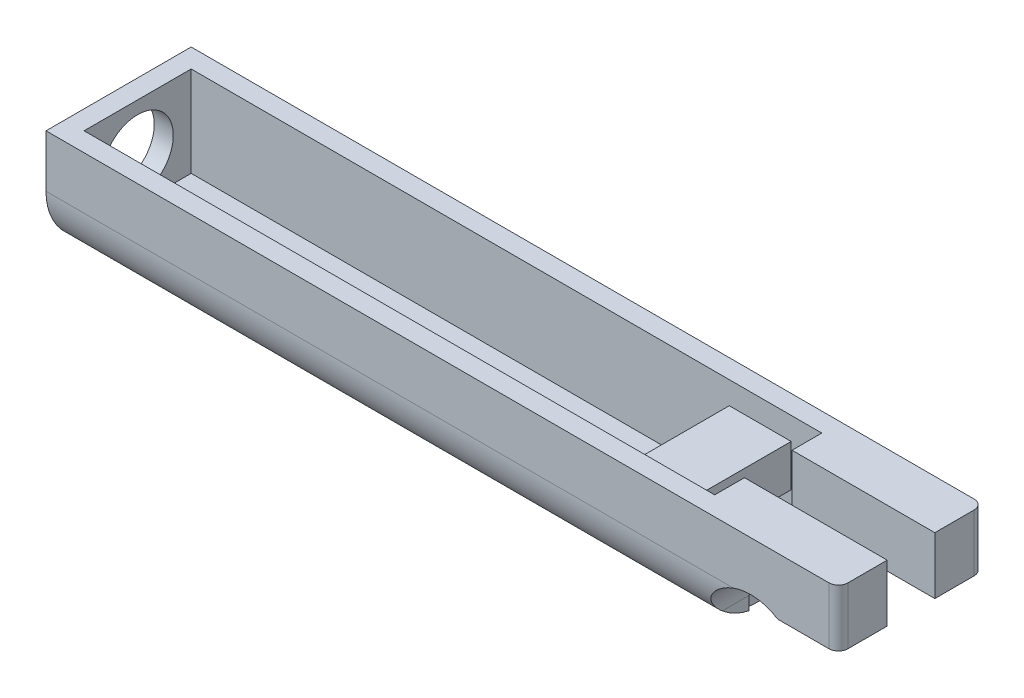
ISO-10303-21;
HEADER;
FILE_DESCRIPTION(('STEP AP214'),'2;1');
FILE_NAME('part.step','',(''),(''),'','','');
FILE_SCHEMA(('AUTOMOTIVE_DESIGN { 1 0 10303 214 1 1 1 1 }'));
ENDSEC;
DATA;
#1=APPLICATION_CONTEXT('core data for automotive mechanical design processes');
#2=APPLICATION_PROTOCOL_DEFINITION('international standard','automotive_design',2000,#1);
#3=PRODUCT_CONTEXT('',#1,'mechanical');
#4=PRODUCT('Part','Part','',(#3));
#5=PRODUCT_RELATED_PRODUCT_CATEGORY('part','',(#4));
#6=PRODUCT_DEFINITION_FORMATION('','',#4);
#7=PRODUCT_DEFINITION_CONTEXT('part definition',#1,'design');
#8=PRODUCT_DEFINITION('design','',#6,#7);
#9=PRODUCT_DEFINITION_SHAPE('','',#8);
#10=(LENGTH_UNIT() NAMED_UNIT(*) SI_UNIT(.MILLI.,.METRE.));
#11=(NAMED_UNIT(*) PLANE_ANGLE_UNIT() SI_UNIT($,.RADIAN.));
#12=(NAMED_UNIT(*) SI_UNIT($,.STERADIAN.) SOLID_ANGLE_UNIT());
#13=UNCERTAINTY_MEASURE_WITH_UNIT(LENGTH_MEASURE(1.E-05),#10,'distance_accuracy_value','');
#14=(GEOMETRIC_REPRESENTATION_CONTEXT(3) GLOBAL_UNCERTAINTY_ASSIGNED_CONTEXT((#13)) GLOBAL_UNIT_ASSIGNED_CONTEXT((#10,
#11,#12)) REPRESENTATION_CONTEXT('',''));
#15=CARTESIAN_POINT('',(0.,0.,0.));
#16=DIRECTION('',(0.,0.,1.));
#17=DIRECTION('',(1.,0.,0.));
#18=AXIS2_PLACEMENT_3D('',#15,#16,#17);
#19=CARTESIAN_POINT('',(25.3098495212039,5.00000000000001,40.3987688098495));
#20=DIRECTION('',(0.,0.,1.));
#21=DIRECTION('',(1.,0.,0.));
#22=AXIS2_PLACEMENT_3D('',#19,#20,#21);
#23=PLANE('',#22);
#24=DIRECTION('',(1.,0.,0.));
#25=VECTOR('',#24,1.);
#26=CARTESIAN_POINT('',(25.3098495212039,24.,40.3987688098495));
#27=LINE('',#26,#25);
#28=CARTESIAN_POINT('',(-107.190150478796,24.,40.3987688098495));
#29=VERTEX_POINT('',#28);
#30=CARTESIAN_POINT('',(25.3098495212039,24.,40.3987688098495));
#31=VERTEX_POINT('',#30);
#32=EDGE_CURVE('E286',#29,#31,#27,.T.);
#33=ORIENTED_EDGE('',*,*,#32,.T.);
#34=DIRECTION('',(0.,1.,0.));
#35=VECTOR('',#34,1.);
#36=CARTESIAN_POINT('',(25.3098495212039,5.00000000000001,40.3987688098495));
#37=LINE('',#36,#35);
#38=CARTESIAN_POINT('',(25.3098495212039,5.00000000000001,40.3987688098495));
#39=VERTEX_POINT('',#38);
#40=EDGE_CURVE('E289',#39,#31,#37,.T.);
#41=ORIENTED_EDGE('',*,*,#40,.F.);
#42=DIRECTION('',(1.,0.,0.));
#43=VECTOR('',#42,1.);
#44=CARTESIAN_POINT('',(25.3098495212039,5.00000000000001,40.3987688098495));
#45=LINE('',#44,#43);
#46=CARTESIAN_POINT('',(-107.190150478796,5.00000000000001,40.3987688098495));
#47=VERTEX_POINT('',#46);
#48=EDGE_CURVE('E274',#47,#39,#45,.T.);
#49=ORIENTED_EDGE('',*,*,#48,.F.);
#50=DIRECTION('',(0.,1.,0.));
#51=VECTOR('',#50,1.);
#52=CARTESIAN_POINT('',(-107.190150478796,5.00000000000001,40.3987688098495));
#53=LINE('',#52,#51);
#54=EDGE_CURVE('E292',#47,#29,#53,.T.);
#55=ORIENTED_EDGE('',*,*,#54,.T.);
#56=EDGE_LOOP('',(#33,#41,#49,#55));
#57=FACE_BOUND('',#56,.T.);
#58=DIRECTION('',(0.,1.,0.));
#59=VECTOR('',#58,1.);
#60=CARTESIAN_POINT('',(5.87696812174511,10.4574026256472,40.3987688098495));
#61=LINE('',#60,#59);
#62=CARTESIAN_POINT('',(5.87696812174511,10.4574026256472,40.3987688098495));
#63=VERTEX_POINT('',#62);
#64=CARTESIAN_POINT('',(5.87696812174511,19.2574026256472,40.3987688098495));
#65=VERTEX_POINT('',#64);
#66=EDGE_CURVE('E244',#63,#65,#61,.T.);
#67=ORIENTED_EDGE('',*,*,#66,.F.);
#68=DIRECTION('',(-1.,0.,0.));
#69=VECTOR('',#68,1.);
#70=CARTESIAN_POINT('',(5.87696812174511,10.4574026256472,40.3987688098495));
#71=LINE('',#70,#69);
#72=CARTESIAN_POINT('',(18.8769681217451,10.4574026256472,40.3987688098495));
#73=VERTEX_POINT('',#72);
#74=EDGE_CURVE('E250',#73,#63,#71,.T.);
#75=ORIENTED_EDGE('',*,*,#74,.F.);
#76=DIRECTION('',(0.,-1.,0.));
#77=VECTOR('',#76,1.);
#78=CARTESIAN_POINT('',(18.8769681217451,10.4574026256472,40.3987688098495));
#79=LINE('',#78,#77);
#80=CARTESIAN_POINT('',(18.8769681217451,19.2574026256472,40.3987688098495));
#81=VERTEX_POINT('',#80);
#82=EDGE_CURVE('E62',#81,#73,#79,.T.);
#83=ORIENTED_EDGE('',*,*,#82,.F.);
#84=DIRECTION('',(1.,0.,0.));
#85=VECTOR('',#84,1.);
#86=CARTESIAN_POINT('',(5.87696812174511,19.2574026256472,40.3987688098495));
#87=LINE('',#86,#85);
#88=EDGE_CURVE('E57',#65,#81,#87,.T.);
#89=ORIENTED_EDGE('',*,*,#88,.F.);
#90=EDGE_LOOP('',(#67,#75,#83,#89));
#91=FACE_BOUND('',#90,.T.);
#92=ADVANCED_FACE('F36',(#57,#91),#23,.F.);
#93=CARTESIAN_POINT('',(25.3098495212039,5.00000000000001,17.8987688098495));
#94=DIRECTION('',(0.,0.,-1.));
#95=DIRECTION('',(-1.,0.,0.));
#96=AXIS2_PLACEMENT_3D('',#93,#94,#95);
#97=PLANE('',#96);
#98=DIRECTION('',(-1.,0.,0.));
#99=VECTOR('',#98,1.);
#100=CARTESIAN_POINT('',(25.3098495212039,24.,17.8987688098495));
#101=LINE('',#100,#99);
#102=CARTESIAN_POINT('',(25.3098495212039,24.,17.8987688098495));
#103=VERTEX_POINT('',#102);
#104=CARTESIAN_POINT('',(-107.190150478796,24.,17.8987688098495));
#105=VERTEX_POINT('',#104);
#106=EDGE_CURVE('E280',#103,#105,#101,.T.);
#107=ORIENTED_EDGE('',*,*,#106,.T.);
#108=DIRECTION('',(0.,1.,0.));
#109=VECTOR('',#108,1.);
#110=CARTESIAN_POINT('',(-107.190150478796,5.00000000000001,17.8987688098495));
#111=LINE('',#110,#109);
#112=CARTESIAN_POINT('',(-107.190150478796,5.00000000000001,17.8987688098495));
#113=VERTEX_POINT('',#112);
#114=EDGE_CURVE('E294',#113,#105,#111,.T.);
#115=ORIENTED_EDGE('',*,*,#114,.F.);
#116=DIRECTION('',(-1.,0.,0.));
#117=VECTOR('',#116,1.);
#118=CARTESIAN_POINT('',(25.3098495212039,5.00000000000001,17.8987688098495));
#119=LINE('',#118,#117);
#120=CARTESIAN_POINT('',(25.3098495212039,5.00000000000001,17.8987688098495));
#121=VERTEX_POINT('',#120);
#122=EDGE_CURVE('E266',#121,#113,#119,.T.);
#123=ORIENTED_EDGE('',*,*,#122,.F.);
#124=DIRECTION('',(0.,1.,0.));
#125=VECTOR('',#124,1.);
#126=CARTESIAN_POINT('',(25.3098495212039,5.00000000000001,17.8987688098495));
#127=LINE('',#126,#125);
#128=EDGE_CURVE('E277',#121,#103,#127,.T.);
#129=ORIENTED_EDGE('',*,*,#128,.T.);
#130=EDGE_LOOP('',(#107,#115,#123,#129));
#131=FACE_BOUND('',#130,.T.);
#132=DIRECTION('',(0.,1.,0.));
#133=VECTOR('',#132,1.);
#134=CARTESIAN_POINT('',(5.87696812174511,10.4574026256472,17.8987688098495));
#135=LINE('',#134,#133);
#136=CARTESIAN_POINT('',(5.87696812174511,10.4574026256472,17.8987688098495));
#137=VERTEX_POINT('',#136);
#138=CARTESIAN_POINT('',(5.87696812174511,19.2574026256472,17.8987688098495));
#139=VERTEX_POINT('',#138);
#140=EDGE_CURVE('E251',#137,#139,#135,.T.);
#141=ORIENTED_EDGE('',*,*,#140,.T.);
#142=DIRECTION('',(1.,0.,0.));
#143=VECTOR('',#142,1.);
#144=CARTESIAN_POINT('',(5.87696812174511,19.2574026256472,17.8987688098495));
#145=LINE('',#144,#143);
#146=CARTESIAN_POINT('',(18.8769681217451,19.2574026256472,17.8987688098495));
#147=VERTEX_POINT('',#146);
#148=EDGE_CURVE('E224',#139,#147,#145,.T.);
#149=ORIENTED_EDGE('',*,*,#148,.T.);
#150=DIRECTION('',(0.,-1.,0.));
#151=VECTOR('',#150,1.);
#152=CARTESIAN_POINT('',(18.8769681217451,10.4574026256472,17.8987688098495));
#153=LINE('',#152,#151);
#154=CARTESIAN_POINT('',(18.8769681217451,10.4574026256472,17.8987688098495));
#155=VERTEX_POINT('',#154);
#156=EDGE_CURVE('E217',#147,#155,#153,.T.);
#157=ORIENTED_EDGE('',*,*,#156,.T.);
#158=DIRECTION('',(-1.,0.,0.));
#159=VECTOR('',#158,1.);
#160=CARTESIAN_POINT('',(5.87696812174511,10.4574026256472,17.8987688098495));
#161=LINE('',#160,#159);
#162=EDGE_CURVE('E221',#155,#137,#161,.T.);
#163=ORIENTED_EDGE('',*,*,#162,.T.);
#164=EDGE_LOOP('',(#141,#149,#157,#163));
#165=FACE_BOUND('',#164,.T.);
#166=ADVANCED_FACE('F219',(#131,#165),#97,.F.);
#167=CARTESIAN_POINT('',(25.3098495212038,24.,34.1487688098495));
#168=DIRECTION('',(-1.,0.,0.));
#169=DIRECTION('',(0.,0.,1.));
#170=AXIS2_PLACEMENT_3D('',#167,#168,#169);
#171=PLANE('',#170);
#172=DIRECTION('',(0.,0.,-1.));
#173=VECTOR('',#172,1.);
#174=CARTESIAN_POINT('',(25.3098495212039,5.00000000000001,40.3987688098495));
#175=LINE('',#174,#173);
#176=CARTESIAN_POINT('',(25.3098495212039,5.00000000000001,34.1487688098495));
#177=VERTEX_POINT('',#176);
#178=CARTESIAN_POINT('',(25.3098495212039,5.00000000000001,24.1487688098495));
#179=VERTEX_POINT('',#178);
#180=EDGE_CURVE('E267',#177,#179,#175,.T.);
#181=ORIENTED_EDGE('',*,*,#180,.F.);
#182=DIRECTION('',(0.,-1.,0.));
#183=VECTOR('',#182,1.);
#184=CARTESIAN_POINT('',(25.3098495212038,24.,34.1487688098495));
#185=LINE('',#184,#183);
#186=CARTESIAN_POINT('',(25.3098495212038,0.294194240426936,34.1487688098495));
#187=VERTEX_POINT('',#186);
#188=EDGE_CURVE('E344',#177,#187,#185,.T.);
#189=ORIENTED_EDGE('',*,*,#188,.T.);
#190=CARTESIAN_POINT('',(25.3098495212039,13.,31.3987688098495));
#191=DIRECTION('',(-1.,0.,0.));
#192=DIRECTION('',(0.,0.,1.));
#193=AXIS2_PLACEMENT_3D('',#190,#191,#192);
#194=CIRCLE('',#193,13.);
#195=CARTESIAN_POINT('',(25.3098495212038,0.,31.3987688098495));
#196=VERTEX_POINT('',#195);
#197=EDGE_CURVE('E514',#187,#196,#194,.F.);
#198=ORIENTED_EDGE('',*,*,#197,.T.);
#199=DIRECTION('',(0.,0.,-1.));
#200=VECTOR('',#199,1.);
#201=CARTESIAN_POINT('',(25.3098495212038,0.,34.1487688098495));
#202=LINE('',#201,#200);
#203=CARTESIAN_POINT('',(25.3098495212038,0.,26.8987688098495));
#204=VERTEX_POINT('',#203);
#205=EDGE_CURVE('E324',#196,#204,#202,.T.);
#206=ORIENTED_EDGE('',*,*,#205,.T.);
#207=CARTESIAN_POINT('',(25.3098495212039,13.,26.8987688098495));
#208=DIRECTION('',(-1.,0.,0.));
#209=DIRECTION('',(0.,0.,1.));
#210=AXIS2_PLACEMENT_3D('',#207,#208,#209);
#211=CIRCLE('',#210,13.);
#212=CARTESIAN_POINT('',(25.3098495212038,0.29419424042694,24.1487688098495));
#213=VERTEX_POINT('',#212);
#214=EDGE_CURVE('E511',#204,#213,#211,.F.);
#215=ORIENTED_EDGE('',*,*,#214,.T.);
#216=DIRECTION('',(0.,-1.,0.));
#217=VECTOR('',#216,1.);
#218=CARTESIAN_POINT('',(25.3098495212038,24.,24.1487688098495));
#219=LINE('',#218,#217);
#220=EDGE_CURVE('E341',#179,#213,#219,.T.);
#221=ORIENTED_EDGE('',*,*,#220,.F.);
#222=EDGE_LOOP('',(#181,#189,#198,#206,#215,#221));
#223=FACE_BOUND('',#222,.T.);
#224=ADVANCED_FACE('F423',(#223),#171,.F.);
#225=CARTESIAN_POINT('',(55.3098495212039,24.,13.8987688098495));
#226=DIRECTION('',(-1.,0.,0.));
#227=DIRECTION('',(0.,0.,1.));
#228=AXIS2_PLACEMENT_3D('',#225,#226,#227);
#229=PLANE('',#228);
#230=DIRECTION('',(0.,0.,-1.));
#231=VECTOR('',#230,1.);
#232=CARTESIAN_POINT('',(55.3098495212039,12.,44.3987688098495));
#233=LINE('',#232,#231);
#234=CARTESIAN_POINT('',(55.3098495212039,12.,24.1487688098495));
#235=VERTEX_POINT('',#234);
#236=CARTESIAN_POINT('',(55.3098495212039,12.,15.8987688098495));
#237=VERTEX_POINT('',#236);
#238=EDGE_CURVE('E314',#235,#237,#233,.T.);
#239=ORIENTED_EDGE('',*,*,#238,.T.);
#240=DIRECTION('',(0.,-1.,0.));
#241=VECTOR('',#240,1.);
#242=CARTESIAN_POINT('',(55.3098495212039,24.,15.8987688098495));
#243=LINE('',#242,#241);
#244=CARTESIAN_POINT('',(55.3098495212039,24.,15.8987688098495));
#245=VERTEX_POINT('',#244);
#246=EDGE_CURVE('E379',#237,#245,#243,.F.);
#247=ORIENTED_EDGE('',*,*,#246,.T.);
#248=DIRECTION('',(0.,0.,-1.));
#249=VECTOR('',#248,1.);
#250=CARTESIAN_POINT('',(55.3098495212039,24.,13.8987688098495));
#251=LINE('',#250,#249);
#252=CARTESIAN_POINT('',(55.3098495212039,24.,24.1487688098495));
#253=VERTEX_POINT('',#252);
#254=EDGE_CURVE('E350',#253,#245,#251,.T.);
#255=ORIENTED_EDGE('',*,*,#254,.F.);
#256=DIRECTION('',(0.,-1.,0.));
#257=VECTOR('',#256,1.);
#258=CARTESIAN_POINT('',(55.3098495212039,24.,24.1487688098495));
#259=LINE('',#258,#257);
#260=EDGE_CURVE('E334',#253,#235,#259,.T.);
#261=ORIENTED_EDGE('',*,*,#260,.T.);
#262=EDGE_LOOP('',(#239,#247,#255,#261));
#263=FACE_BOUND('',#262,.T.);
#264=ADVANCED_FACE('F426',(#263),#229,.F.);
#265=CARTESIAN_POINT('',(55.3098495212039,24.,42.3987688098495));
#266=VERTEX_POINT('',#265);
#267=CARTESIAN_POINT('',(55.3098495212038,24.,34.1487688098495));
#268=VERTEX_POINT('',#267);
#269=EDGE_CURVE('E347',#266,#268,#251,.T.);
#270=ORIENTED_EDGE('',*,*,#269,.F.);
#271=DIRECTION('',(0.,-1.,0.));
#272=VECTOR('',#271,1.);
#273=CARTESIAN_POINT('',(55.3098495212039,24.,42.3987688098495));
#274=LINE('',#273,#272);
#275=CARTESIAN_POINT('',(55.3098495212039,12.,42.3987688098495));
#276=VERTEX_POINT('',#275);
#277=EDGE_CURVE('E385',#266,#276,#274,.T.);
#278=ORIENTED_EDGE('',*,*,#277,.T.);
#279=CARTESIAN_POINT('',(55.3098495212039,12.,34.1487688098495));
#280=VERTEX_POINT('',#279);
#281=EDGE_CURVE('E312',#276,#280,#233,.T.);
#282=ORIENTED_EDGE('',*,*,#281,.T.);
#283=DIRECTION('',(0.,-1.,0.));
#284=VECTOR('',#283,1.);
#285=CARTESIAN_POINT('',(55.3098495212038,24.,34.1487688098495));
#286=LINE('',#285,#284);
#287=EDGE_CURVE('E331',#268,#280,#286,.T.);
#288=ORIENTED_EDGE('',*,*,#287,.F.);
#289=EDGE_LOOP('',(#270,#278,#282,#288));
#290=FACE_BOUND('',#289,.T.);
#291=ADVANCED_FACE('F450',(#290),#229,.F.);
#292=CARTESIAN_POINT('',(-111.190150478796,24.,13.8987688098495));
#293=DIRECTION('',(0.,0.,1.));
#294=DIRECTION('',(1.,0.,0.));
#295=AXIS2_PLACEMENT_3D('',#292,#293,#294);
#296=PLANE('',#295);
#297=CARTESIAN_POINT('',(36.863543885732,3.09737116728347,13.8987688098495));
#298=DIRECTION('',(0.,0.,-1.));
#299=DIRECTION('',(-1.,0.,0.));
#300=AXIS2_PLACEMENT_3D('',#297,#298,#299);
#301=CIRCLE('',#300,10.548357553415);
#302=CARTESIAN_POINT('',(33.229566825246,13.,13.8987688098495));
#303=VERTEX_POINT('',#302);
#304=CARTESIAN_POINT('',(42.5213744718818,12.,13.8987688098495));
#305=VERTEX_POINT('',#304);
#306=EDGE_CURVE('E291',#303,#305,#301,.T.);
#307=ORIENTED_EDGE('',*,*,#306,.F.);
#308=DIRECTION('',(-1.,0.,0.));
#309=VECTOR('',#308,1.);
#310=CARTESIAN_POINT('',(-111.190150478796,13.,13.8987688098495));
#311=LINE('',#310,#309);
#312=CARTESIAN_POINT('',(-111.190150478796,13.,13.8987688098495));
#313=VERTEX_POINT('',#312);
#314=EDGE_CURVE('E526',#303,#313,#311,.T.);
#315=ORIENTED_EDGE('',*,*,#314,.T.);
#316=DIRECTION('',(0.,-1.,0.));
#317=VECTOR('',#316,1.);
#318=CARTESIAN_POINT('',(-111.190150478796,24.,13.8987688098495));
#319=LINE('',#318,#317);
#320=CARTESIAN_POINT('',(-111.190150478796,24.,13.8987688098495));
#321=VERTEX_POINT('',#320);
#322=EDGE_CURVE('E362',#321,#313,#319,.T.);
#323=ORIENTED_EDGE('',*,*,#322,.F.);
#324=DIRECTION('',(-1.,0.,0.));
#325=VECTOR('',#324,1.);
#326=CARTESIAN_POINT('',(-111.190150478796,24.,13.8987688098495));
#327=LINE('',#326,#325);
#328=CARTESIAN_POINT('',(53.3098495212039,24.,13.8987688098495));
#329=VERTEX_POINT('',#328);
#330=EDGE_CURVE('E349',#329,#321,#327,.T.);
#331=ORIENTED_EDGE('',*,*,#330,.F.);
#332=DIRECTION('',(0.,-1.,0.));
#333=VECTOR('',#332,1.);
#334=CARTESIAN_POINT('',(53.3098495212039,24.,13.8987688098495));
#335=LINE('',#334,#333);
#336=CARTESIAN_POINT('',(53.3098495212039,12.,13.8987688098495));
#337=VERTEX_POINT('',#336);
#338=EDGE_CURVE('E374',#329,#337,#335,.T.);
#339=ORIENTED_EDGE('',*,*,#338,.T.);
#340=DIRECTION('',(1.,0.,0.));
#341=VECTOR('',#340,1.);
#342=CARTESIAN_POINT('',(42.5213744718818,12.,13.8987688098495));
#343=LINE('',#342,#341);
#344=EDGE_CURVE('E301',#305,#337,#343,.T.);
#345=ORIENTED_EDGE('',*,*,#344,.F.);
#346=EDGE_LOOP('',(#307,#315,#323,#331,#339,#345));
#347=FACE_BOUND('',#346,.T.);
#348=ADVANCED_FACE('F446',(#347),#296,.F.);
#349=CARTESIAN_POINT('',(-111.190150478796,24.,13.8987688098495));
#350=DIRECTION('',(1.,0.,0.));
#351=DIRECTION('',(0.,0.,-1.));
#352=AXIS2_PLACEMENT_3D('',#349,#350,#351);
#353=PLANE('',#352);
#354=CARTESIAN_POINT('',(-111.190150478796,13.8,29.1487688098495));
#355=DIRECTION('',(-1.,0.,0.));
#356=DIRECTION('',(0.,0.,1.));
#357=AXIS2_PLACEMENT_3D('',#354,#355,#356);
#358=CIRCLE('',#357,7.5);
#359=CARTESIAN_POINT('',(-111.190150478796,13.8,36.6487688098495));
#360=VERTEX_POINT('',#359);
#361=EDGE_CURVE('E256',#360,#360,#358,.T.);
#362=ORIENTED_EDGE('',*,*,#361,.F.);
#363=EDGE_LOOP('',(#362));
#364=FACE_BOUND('',#363,.T.);
#365=DIRECTION('',(0.,0.,1.));
#366=VECTOR('',#365,1.);
#367=CARTESIAN_POINT('',(-111.190150478796,0.,13.8987688098495));
#368=LINE('',#367,#366);
#369=CARTESIAN_POINT('',(-111.190150478796,0.,26.8987688098495));
#370=VERTEX_POINT('',#369);
#371=CARTESIAN_POINT('',(-111.190150478796,0.,31.3987688098495));
#372=VERTEX_POINT('',#371);
#373=EDGE_CURVE('E337',#370,#372,#368,.T.);
#374=ORIENTED_EDGE('',*,*,#373,.T.);
#375=CARTESIAN_POINT('',(-111.190150478796,13.,31.3987688098495));
#376=DIRECTION('',(1.,0.,0.));
#377=DIRECTION('',(0.,0.,-1.));
#378=AXIS2_PLACEMENT_3D('',#375,#376,#377);
#379=CIRCLE('',#378,13.);
#380=CARTESIAN_POINT('',(-111.190150478796,13.,44.3987688098495));
#381=VERTEX_POINT('',#380);
#382=EDGE_CURVE('E524',#372,#381,#379,.F.);
#383=ORIENTED_EDGE('',*,*,#382,.T.);
#384=DIRECTION('',(0.,-1.,0.));
#385=VECTOR('',#384,1.);
#386=CARTESIAN_POINT('',(-111.190150478796,24.,44.3987688098495));
#387=LINE('',#386,#385);
#388=CARTESIAN_POINT('',(-111.190150478796,24.,44.3987688098495));
#389=VERTEX_POINT('',#388);
#390=EDGE_CURVE('E357',#389,#381,#387,.T.);
#391=ORIENTED_EDGE('',*,*,#390,.F.);
#392=DIRECTION('',(0.,0.,1.));
#393=VECTOR('',#392,1.);
#394=CARTESIAN_POINT('',(-111.190150478796,24.,13.8987688098495));
#395=LINE('',#394,#393);
#396=EDGE_CURVE('E352',#321,#389,#395,.T.);
#397=ORIENTED_EDGE('',*,*,#396,.F.);
#398=ORIENTED_EDGE('',*,*,#322,.T.);
#399=CARTESIAN_POINT('',(-111.190150478796,13.,26.8987688098495));
#400=DIRECTION('',(1.,0.,0.));
#401=DIRECTION('',(0.,0.,-1.));
#402=AXIS2_PLACEMENT_3D('',#399,#400,#401);
#403=CIRCLE('',#402,13.);
#404=EDGE_CURVE('E522',#313,#370,#403,.F.);
#405=ORIENTED_EDGE('',*,*,#404,.T.);
#406=EDGE_LOOP('',(#374,#383,#391,#397,#398,#405));
#407=FACE_BOUND('',#406,.T.);
#408=ADVANCED_FACE('F442',(#364,#407),#353,.F.);
#409=CARTESIAN_POINT('',(-111.190150478796,24.,44.3987688098495));
#410=DIRECTION('',(0.,0.,-1.));
#411=DIRECTION('',(-1.,0.,0.));
#412=AXIS2_PLACEMENT_3D('',#409,#410,#411);
#413=PLANE('',#412);
#414=ORIENTED_EDGE('',*,*,#390,.T.);
#415=DIRECTION('',(1.,0.,0.));
#416=VECTOR('',#415,1.);
#417=CARTESIAN_POINT('',(-111.190150478796,13.,44.3987688098495));
#418=LINE('',#417,#416);
#419=CARTESIAN_POINT('',(33.229566825246,13.,44.3987688098495));
#420=VERTEX_POINT('',#419);
#421=EDGE_CURVE('E392',#381,#420,#418,.T.);
#422=ORIENTED_EDGE('',*,*,#421,.T.);
#423=CARTESIAN_POINT('',(36.863543885732,3.09737116728347,44.3987688098495));
#424=DIRECTION('',(0.,0.,-1.));
#425=DIRECTION('',(-1.,0.,0.));
#426=AXIS2_PLACEMENT_3D('',#423,#424,#425);
#427=CIRCLE('',#426,10.548357553415);
#428=CARTESIAN_POINT('',(42.5213744718818,12.,44.3987688098495));
#429=VERTEX_POINT('',#428);
#430=EDGE_CURVE('E298',#420,#429,#427,.T.);
#431=ORIENTED_EDGE('',*,*,#430,.T.);
#432=DIRECTION('',(1.,0.,0.));
#433=VECTOR('',#432,1.);
#434=CARTESIAN_POINT('',(42.5213744718818,12.,44.3987688098495));
#435=LINE('',#434,#433);
#436=CARTESIAN_POINT('',(53.3098495212039,12.,44.3987688098495));
#437=VERTEX_POINT('',#436);
#438=EDGE_CURVE('E300',#429,#437,#435,.T.);
#439=ORIENTED_EDGE('',*,*,#438,.T.);
#440=DIRECTION('',(0.,-1.,0.));
#441=VECTOR('',#440,1.);
#442=CARTESIAN_POINT('',(53.3098495212039,24.,44.3987688098495));
#443=LINE('',#442,#441);
#444=CARTESIAN_POINT('',(53.3098495212039,24.,44.3987688098495));
#445=VERTEX_POINT('',#444);
#446=EDGE_CURVE('E390',#437,#445,#443,.F.);
#447=ORIENTED_EDGE('',*,*,#446,.T.);
#448=DIRECTION('',(1.,0.,0.));
#449=VECTOR('',#448,1.);
#450=CARTESIAN_POINT('',(-111.190150478796,24.,44.3987688098495));
#451=LINE('',#450,#449);
#452=EDGE_CURVE('E354',#389,#445,#451,.T.);
#453=ORIENTED_EDGE('',*,*,#452,.F.);
#454=EDGE_LOOP('',(#414,#422,#431,#439,#447,#453));
#455=FACE_BOUND('',#454,.T.);
#456=ADVANCED_FACE('F435',(#455),#413,.F.);
#457=CARTESIAN_POINT('',(0.,24.,0.));
#458=DIRECTION('',(0.,1.,0.));
#459=DIRECTION('',(0.,0.,1.));
#460=AXIS2_PLACEMENT_3D('',#457,#458,#459);
#461=PLANE('',#460);
#462=DIRECTION('',(0.,0.,-1.));
#463=VECTOR('',#462,1.);
#464=CARTESIAN_POINT('',(25.3098495212039,24.,40.3987688098495));
#465=LINE('',#464,#463);
#466=CARTESIAN_POINT('',(25.3098495212038,24.,34.1487688098495));
#467=VERTEX_POINT('',#466);
#468=EDGE_CURVE('E278',#31,#467,#465,.T.);
#469=ORIENTED_EDGE('',*,*,#468,.F.);
#470=ORIENTED_EDGE('',*,*,#32,.F.);
#471=DIRECTION('',(0.,0.,1.));
#472=VECTOR('',#471,1.);
#473=CARTESIAN_POINT('',(-107.190150478796,24.,40.3987688098495));
#474=LINE('',#473,#472);
#475=EDGE_CURVE('E283',#105,#29,#474,.T.);
#476=ORIENTED_EDGE('',*,*,#475,.F.);
#477=ORIENTED_EDGE('',*,*,#106,.F.);
#478=CARTESIAN_POINT('',(25.3098495212039,24.,24.1487688098495));
#479=VERTEX_POINT('',#478);
#480=EDGE_CURVE('E260',#479,#103,#465,.T.);
#481=ORIENTED_EDGE('',*,*,#480,.F.);
#482=DIRECTION('',(1.,0.,0.));
#483=VECTOR('',#482,1.);
#484=CARTESIAN_POINT('',(25.3098495212038,24.,24.1487688098495));
#485=LINE('',#484,#483);
#486=EDGE_CURVE('E328',#479,#253,#485,.T.);
#487=ORIENTED_EDGE('',*,*,#486,.T.);
#488=ORIENTED_EDGE('',*,*,#254,.T.);
#489=CARTESIAN_POINT('',(53.3098495212039,24.,15.8987688098495));
#490=DIRECTION('',(0.,1.,0.));
#491=DIRECTION('',(0.,0.,1.));
#492=AXIS2_PLACEMENT_3D('',#489,#490,#491);
#493=CIRCLE('',#492,2.);
#494=EDGE_CURVE('E383',#245,#329,#493,.T.);
#495=ORIENTED_EDGE('',*,*,#494,.T.);
#496=ORIENTED_EDGE('',*,*,#330,.T.);
#497=ORIENTED_EDGE('',*,*,#396,.T.);
#498=ORIENTED_EDGE('',*,*,#452,.T.);
#499=CARTESIAN_POINT('',(53.3098495212039,24.,42.3987688098495));
#500=DIRECTION('',(0.,1.,0.));
#501=DIRECTION('',(0.,0.,1.));
#502=AXIS2_PLACEMENT_3D('',#499,#500,#501);
#503=CIRCLE('',#502,2.);
#504=EDGE_CURVE('E381',#445,#266,#503,.T.);
#505=ORIENTED_EDGE('',*,*,#504,.T.);
#506=ORIENTED_EDGE('',*,*,#269,.T.);
#507=DIRECTION('',(-1.,0.,0.));
#508=VECTOR('',#507,1.);
#509=CARTESIAN_POINT('',(25.3098495212038,24.,34.1487688098495));
#510=LINE('',#509,#508);
#511=EDGE_CURVE('E325',#268,#467,#510,.T.);
#512=ORIENTED_EDGE('',*,*,#511,.T.);
#513=EDGE_LOOP('',(#469,#470,#476,#477,#481,#487,#488,#495,#496,#497,#498,#505,#506,#512));
#514=FACE_BOUND('',#513,.T.);
#515=ADVANCED_FACE('F432',(#514),#461,.T.);
#516=CARTESIAN_POINT('',(0.,0.,0.));
#517=DIRECTION('',(0.,1.,0.));
#518=DIRECTION('',(0.,0.,1.));
#519=AXIS2_PLACEMENT_3D('',#516,#517,#518);
#520=PLANE('',#519);
#521=ORIENTED_EDGE('',*,*,#205,.F.);
#522=DIRECTION('',(1.,0.,0.));
#523=VECTOR('',#522,1.);
#524=CARTESIAN_POINT('',(0.,0.,31.3987688098495));
#525=LINE('',#524,#523);
#526=EDGE_CURVE('E520',#196,#372,#525,.F.);
#527=ORIENTED_EDGE('',*,*,#526,.T.);
#528=ORIENTED_EDGE('',*,*,#373,.F.);
#529=DIRECTION('',(-1.,0.,0.));
#530=VECTOR('',#529,1.);
#531=CARTESIAN_POINT('',(0.,0.,26.8987688098495));
#532=LINE('',#531,#530);
#533=EDGE_CURVE('E518',#370,#204,#532,.F.);
#534=ORIENTED_EDGE('',*,*,#533,.T.);
#535=EDGE_LOOP('',(#521,#527,#528,#534));
#536=FACE_BOUND('',#535,.T.);
#537=ADVANCED_FACE('F421',(#536),#520,.F.);
#538=CARTESIAN_POINT('',(25.3098495212038,24.,24.1487688098495));
#539=DIRECTION('',(0.,0.,-1.));
#540=DIRECTION('',(-1.,0.,0.));
#541=AXIS2_PLACEMENT_3D('',#538,#539,#540);
#542=PLANE('',#541);
#543=EDGE_CURVE('E338',#479,#179,#219,.T.);
#544=ORIENTED_EDGE('',*,*,#543,.T.);
#545=ORIENTED_EDGE('',*,*,#220,.T.);
#546=DIRECTION('',(-1.,0.,0.));
#547=VECTOR('',#546,1.);
#548=CARTESIAN_POINT('',(25.3098495212038,0.294194240426938,24.1487688098495));
#549=LINE('',#548,#547);
#550=CARTESIAN_POINT('',(26.315186332317,0.29419424042694,24.1487688098495));
#551=VERTEX_POINT('',#550);
#552=EDGE_CURVE('E529',#213,#551,#549,.F.);
#553=ORIENTED_EDGE('',*,*,#552,.T.);
#554=DIRECTION('',(0.,1.,0.));
#555=VECTOR('',#554,1.);
#556=CARTESIAN_POINT('',(26.315186332317,24.,24.1487688098495));
#557=LINE('',#556,#555);
#558=CARTESIAN_POINT('',(26.315186332317,3.09737116728347,24.1487688098495));
#559=VERTEX_POINT('',#558);
#560=EDGE_CURVE('E319',#551,#559,#557,.T.);
#561=ORIENTED_EDGE('',*,*,#560,.T.);
#562=CARTESIAN_POINT('',(36.863543885732,3.09737116728347,24.1487688098495));
#563=DIRECTION('',(0.,0.,-1.));
#564=DIRECTION('',(-1.,0.,0.));
#565=AXIS2_PLACEMENT_3D('',#562,#563,#564);
#566=CIRCLE('',#565,10.548357553415);
#567=CARTESIAN_POINT('',(42.5213744718818,12.,24.1487688098495));
#568=VERTEX_POINT('',#567);
#569=EDGE_CURVE('E321',#559,#568,#566,.T.);
#570=ORIENTED_EDGE('',*,*,#569,.T.);
#571=DIRECTION('',(1.,0.,0.));
#572=VECTOR('',#571,1.);
#573=CARTESIAN_POINT('',(25.3098495212038,12.,24.1487688098495));
#574=LINE('',#573,#572);
#575=EDGE_CURVE('E310',#568,#235,#574,.T.);
#576=ORIENTED_EDGE('',*,*,#575,.T.);
#577=ORIENTED_EDGE('',*,*,#260,.F.);
#578=ORIENTED_EDGE('',*,*,#486,.F.);
#579=EDGE_LOOP('',(#544,#545,#553,#561,#570,#576,#577,#578));
#580=FACE_BOUND('',#579,.T.);
#581=ADVANCED_FACE('F416',(#580),#542,.F.);
#582=CARTESIAN_POINT('',(25.3098495212038,24.,34.1487688098495));
#583=DIRECTION('',(0.,0.,1.));
#584=DIRECTION('',(1.,0.,0.));
#585=AXIS2_PLACEMENT_3D('',#582,#583,#584);
#586=PLANE('',#585);
#587=DIRECTION('',(0.,-1.,0.));
#588=VECTOR('',#587,1.);
#589=CARTESIAN_POINT('',(26.315186332317,24.,34.1487688098495));
#590=LINE('',#589,#588);
#591=CARTESIAN_POINT('',(26.315186332317,3.09737116728347,34.1487688098495));
#592=VERTEX_POINT('',#591);
#593=CARTESIAN_POINT('',(26.315186332317,0.294194240426936,34.1487688098495));
#594=VERTEX_POINT('',#593);
#595=EDGE_CURVE('E371',#592,#594,#590,.T.);
#596=ORIENTED_EDGE('',*,*,#595,.T.);
#597=DIRECTION('',(1.,0.,0.));
#598=VECTOR('',#597,1.);
#599=CARTESIAN_POINT('',(26.315186332317,0.294194240426936,34.1487688098495));
#600=LINE('',#599,#598);
#601=EDGE_CURVE('E510',#594,#187,#600,.F.);
#602=ORIENTED_EDGE('',*,*,#601,.T.);
#603=ORIENTED_EDGE('',*,*,#188,.F.);
#604=EDGE_CURVE('E342',#467,#177,#185,.T.);
#605=ORIENTED_EDGE('',*,*,#604,.F.);
#606=ORIENTED_EDGE('',*,*,#511,.F.);
#607=ORIENTED_EDGE('',*,*,#287,.T.);
#608=DIRECTION('',(-1.,0.,0.));
#609=VECTOR('',#608,1.);
#610=CARTESIAN_POINT('',(25.3098495212038,12.,34.1487688098495));
#611=LINE('',#610,#609);
#612=CARTESIAN_POINT('',(42.5213744718818,12.,34.1487688098495));
#613=VERTEX_POINT('',#612);
#614=EDGE_CURVE('E365',#280,#613,#611,.T.);
#615=ORIENTED_EDGE('',*,*,#614,.T.);
#616=CARTESIAN_POINT('',(36.863543885732,3.09737116728347,34.1487688098495));
#617=DIRECTION('',(0.,0.,1.));
#618=DIRECTION('',(1.,0.,0.));
#619=AXIS2_PLACEMENT_3D('',#616,#617,#618);
#620=CIRCLE('',#619,10.548357553415);
#621=EDGE_CURVE('E368',#613,#592,#620,.T.);
#622=ORIENTED_EDGE('',*,*,#621,.T.);
#623=EDGE_LOOP('',(#596,#602,#603,#605,#606,#607,#615,#622));
#624=FACE_BOUND('',#623,.T.);
#625=ADVANCED_FACE('F420',(#624),#586,.F.);
#626=CARTESIAN_POINT('',(26.315186332317,3.09737116728347,44.3987688098495));
#627=DIRECTION('',(-1.,0.,0.));
#628=DIRECTION('',(0.,0.,1.));
#629=AXIS2_PLACEMENT_3D('',#626,#627,#628);
#630=PLANE('',#629);
#631=DIRECTION('',(0.,0.,-1.));
#632=VECTOR('',#631,1.);
#633=CARTESIAN_POINT('',(26.315186332317,3.09737116728347,44.3987688098495));
#634=LINE('',#633,#632);
#635=CARTESIAN_POINT('',(26.315186332317,3.09737116728347,39.8212353251555));
#636=VERTEX_POINT('',#635);
#637=EDGE_CURVE('E308',#636,#592,#634,.T.);
#638=ORIENTED_EDGE('',*,*,#637,.F.);
#639=CARTESIAN_POINT('',(26.315186332317,13.,31.3987688098495));
#640=DIRECTION('',(-1.,0.,0.));
#641=DIRECTION('',(0.,0.,1.));
#642=AXIS2_PLACEMENT_3D('',#639,#640,#641);
#643=CIRCLE('',#642,13.);
#644=EDGE_CURVE('E401',#636,#594,#643,.F.);
#645=ORIENTED_EDGE('',*,*,#644,.T.);
#646=ORIENTED_EDGE('',*,*,#595,.F.);
#647=EDGE_LOOP('',(#638,#645,#646));
#648=FACE_BOUND('',#647,.T.);
#649=ADVANCED_FACE('F430',(#648),#630,.F.);
#650=CARTESIAN_POINT('',(42.5213744718818,12.,44.3987688098495));
#651=DIRECTION('',(0.,1.,0.));
#652=DIRECTION('',(0.,0.,1.));
#653=AXIS2_PLACEMENT_3D('',#650,#651,#652);
#654=PLANE('',#653);
#655=ORIENTED_EDGE('',*,*,#281,.F.);
#656=CARTESIAN_POINT('',(53.3098495212039,12.,42.3987688098495));
#657=DIRECTION('',(0.,1.,0.));
#658=DIRECTION('',(0.,0.,1.));
#659=AXIS2_PLACEMENT_3D('',#656,#657,#658);
#660=CIRCLE('',#659,2.);
#661=EDGE_CURVE('E388',#276,#437,#660,.F.);
#662=ORIENTED_EDGE('',*,*,#661,.T.);
#663=ORIENTED_EDGE('',*,*,#438,.F.);
#664=DIRECTION('',(0.,0.,-1.));
#665=VECTOR('',#664,1.);
#666=CARTESIAN_POINT('',(42.5213744718818,12.,44.3987688098495));
#667=LINE('',#666,#665);
#668=EDGE_CURVE('E315',#429,#613,#667,.T.);
#669=ORIENTED_EDGE('',*,*,#668,.T.);
#670=ORIENTED_EDGE('',*,*,#614,.F.);
#671=EDGE_LOOP('',(#655,#662,#663,#669,#670));
#672=FACE_BOUND('',#671,.T.);
#673=ADVANCED_FACE('F492',(#672),#654,.F.);
#674=CARTESIAN_POINT('',(36.863543885732,3.09737116728347,44.3987688098495));
#675=DIRECTION('',(0.,0.,-1.));
#676=DIRECTION('',(-1.,0.,0.));
#677=AXIS2_PLACEMENT_3D('',#674,#675,#676);
#678=CYLINDRICAL_SURFACE('',#677,10.548357553415);
#679=ORIENTED_EDGE('',*,*,#430,.F.);
#680=CARTESIAN_POINT('',(33.229566825246,13.,44.3987688098495));
#681=CARTESIAN_POINT('',(32.9667645524711,12.9035908304838,44.3987310748613));
#682=CARTESIAN_POINT('',(32.707804933315,12.79666011622,44.3976956438665));
#683=CARTESIAN_POINT('',(32.1991600921542,12.5625499373743,44.3919443994159));
#684=CARTESIAN_POINT('',(31.9494776063277,12.4353645564804,44.3872275090443));
#685=CARTESIAN_POINT('',(31.4602277358188,12.1610899118075,44.3723990019821));
#686=CARTESIAN_POINT('',(31.2207012296769,12.0139286901259,44.362267473916));
#687=CARTESIAN_POINT('',(30.7544539117648,11.7011865789021,44.334677509384));
#688=CARTESIAN_POINT('',(30.527731810987,11.535607548465,44.3172198119337));
#689=CARTESIAN_POINT('',(30.0880298089563,11.1868241472045,44.2729048478));
#690=CARTESIAN_POINT('',(29.8750965267649,11.0035647194968,44.2460174842511));
#691=CARTESIAN_POINT('',(29.4654121573065,10.6215933729257,44.1808150591171));
#692=CARTESIAN_POINT('',(29.268661564977,10.4228809818043,44.1424996481779));
#693=CARTESIAN_POINT('',(28.8933431457561,10.01263303446,44.0526066754121));
#694=CARTESIAN_POINT('',(28.714732617767,9.80112955490223,44.0010613161512));
#695=CARTESIAN_POINT('',(28.3764926378667,9.36741201727491,43.882950263962));
#696=CARTESIAN_POINT('',(28.2168612840358,9.1451990355557,43.8163860780242));
#697=CARTESIAN_POINT('',(27.9281606253939,8.7089906856601,43.6721632367964));
#698=CARTESIAN_POINT('',(27.7977279585264,8.49552663553521,43.5956230713492));
#699=CARTESIAN_POINT('',(27.5545494483749,8.06443312881643,43.4276372486792));
#700=CARTESIAN_POINT('',(27.4418028260716,7.84680385616266,43.3361922483336));
#701=CARTESIAN_POINT('',(27.2340096404574,7.40996350439624,43.1379784187862));
#702=CARTESIAN_POINT('',(27.1389701306429,7.19075183090959,43.03120351289));
#703=CARTESIAN_POINT('',(26.9662746909955,6.75348516814068,42.8023619429439));
#704=CARTESIAN_POINT('',(26.888618270323,6.53543014636827,42.6802957108212));
#705=CARTESIAN_POINT('',(26.7535663279192,6.11440278248438,42.4280736826018));
#706=CARTESIAN_POINT('',(26.6953172589328,5.91124215238678,42.2986857785275));
#707=CARTESIAN_POINT('',(26.5927360933596,5.51009183562168,42.0270309864426));
#708=CARTESIAN_POINT('',(26.5484044351161,5.31210231200353,41.8847636929641));
#709=CARTESIAN_POINT('',(26.4724720375824,4.92296203317393,41.5880442707747));
#710=CARTESIAN_POINT('',(26.440871172424,4.73181121036588,41.4335922625511));
#711=CARTESIAN_POINT('',(26.3890558897242,4.35776490022054,41.1133140528724));
#712=CARTESIAN_POINT('',(26.3688388744037,4.17486753822486,40.9474904560953));
#713=CARTESIAN_POINT('',(26.3400865636887,3.8388464988518,40.6248792617482));
#714=CARTESIAN_POINT('',(26.33047821173,3.68471251009873,40.4692332884928));
#715=CARTESIAN_POINT('',(26.3180374496095,3.38477909845589,40.1506457013921));
#716=CARTESIAN_POINT('',(26.3151866127776,3.23895807099227,39.9877251646097));
#717=CARTESIAN_POINT('',(26.315186332317,3.09737116728347,39.8212353251555));
#718=B_SPLINE_CURVE_WITH_KNOTS('',3,(#680,#681,#682,#683,#684,#685,#686,#687,#688,#689,#690,
#691,#692,#693,#694,#695,#696,#697,#698,#699,#700,#701,#702,#703,#704,#705,#706,#707,#708,#709,
#710,#711,#712,#713,#714,#715,#716,#717),.UNSPECIFIED.,.F.,.F.,(4,2,2,2,2,2,2,2,2,2,2,2,2,2,2,2,
2,2,4),(0.,0.839587200136719,1.67942009188025,2.52236278813455,3.3652204743133,4.2107931842281,
5.05639174585239,5.89995126779542,6.74342618452116,7.52721024587081,8.31095977408535,
9.09502083868792,9.87905976126442,10.6216841684299,11.3643319629701,12.1069724148351,
12.8494433284079,13.5068434283024,14.16244882994),.UNSPECIFIED.);
#719=EDGE_CURVE('E395',#420,#636,#718,.T.);
#720=ORIENTED_EDGE('',*,*,#719,.T.);
#721=ORIENTED_EDGE('',*,*,#637,.T.);
#722=ORIENTED_EDGE('',*,*,#621,.F.);
#723=ORIENTED_EDGE('',*,*,#668,.F.);
#724=EDGE_LOOP('',(#679,#720,#721,#722,#723));
#725=FACE_BOUND('',#724,.T.);
#726=ADVANCED_FACE('F412',(#725),#678,.F.);
#727=CARTESIAN_POINT('',(26.315186332317,3.09737116728347,18.4763022945435));
#728=VERTEX_POINT('',#727);
#729=EDGE_CURVE('E311',#559,#728,#634,.T.);
#730=ORIENTED_EDGE('',*,*,#729,.T.);
#731=CARTESIAN_POINT('',(26.315186332317,3.09737116728347,18.4763022945435));
#732=CARTESIAN_POINT('',(26.315183208232,3.27744496863084,18.2645201506761));
#733=CARTESIAN_POINT('',(26.3197984112228,3.46442602801802,18.0585023636639));
#734=CARTESIAN_POINT('',(26.3403635784159,3.85104214887381,17.6589835377156));
#735=CARTESIAN_POINT('',(26.3563232019687,4.05068786179426,17.4654933188281));
#736=CARTESIAN_POINT('',(26.4017802614768,4.4620462860613,17.0915782232371));
#737=CARTESIAN_POINT('',(26.4313357798267,4.67380732138149,16.9112132864167));
#738=CARTESIAN_POINT('',(26.5060048848078,5.10671297286948,16.5656826579529));
#739=CARTESIAN_POINT('',(26.5511140787564,5.32785492422321,16.4005126915994));
#740=CARTESIAN_POINT('',(26.6590263403385,5.77873650124834,16.0853759108686));
#741=CARTESIAN_POINT('',(26.7219378750431,6.00852110217418,15.9355102077975));
#742=CARTESIAN_POINT('',(26.866828997204,6.47266853266724,15.6529804645277));
#743=CARTESIAN_POINT('',(26.9488101194576,6.70703172934682,15.5203178102391));
#744=CARTESIAN_POINT('',(27.1325641918188,7.17649019775377,15.2730688846758));
#745=CARTESIAN_POINT('',(27.2342740615156,7.41158084637968,15.1584270547701));
#746=CARTESIAN_POINT('',(27.4581083053253,7.87993995472869,14.9467389391332));
#747=CARTESIAN_POINT('',(27.5802303558271,8.11320861869649,14.8496906532674));
#748=CARTESIAN_POINT('',(27.8314660417883,8.55142081511923,14.6815850979376));
#749=CARTESIAN_POINT('',(27.9586419123566,8.75685398146694,14.6088956049062));
#750=CARTESIAN_POINT('',(28.228978168543,9.16130344563198,14.476624277897));
#751=CARTESIAN_POINT('',(28.3721376061808,9.36032012310786,14.4170416671762));
#752=CARTESIAN_POINT('',(28.6739202647004,9.75009601798127,14.3099228765365));
#753=CARTESIAN_POINT('',(28.8325633020104,9.94084419024367,14.2624024216553));
#754=CARTESIAN_POINT('',(29.1642230026097,10.3119564761534,14.1782880000204));
#755=CARTESIAN_POINT('',(29.3372398498193,10.4923204568795,14.1416941731062));
#756=CARTESIAN_POINT('',(29.6970682068899,10.8415636326336,14.0779748369803));
#757=CARTESIAN_POINT('',(29.8839169334257,11.0104093067908,14.050876086792));
#758=CARTESIAN_POINT('',(30.2698217284471,11.3347380458856,14.004826863663));
#759=CARTESIAN_POINT('',(30.4688786195334,11.4902202086751,13.9858769404909));
#760=CARTESIAN_POINT('',(30.8778252409262,11.7866028698154,13.9546634163241));
#761=CARTESIAN_POINT('',(31.0877069243985,11.9275139722287,13.9423949247888));
#762=CARTESIAN_POINT('',(31.5171579494929,12.1939555069539,13.9230945095234));
#763=CARTESIAN_POINT('',(31.7367245186338,12.3194903026542,13.916061097327));
#764=CARTESIAN_POINT('',(32.1657337467259,12.5447053659137,13.9062953311052));
#765=CARTESIAN_POINT('',(32.374498286992,12.6456678488419,13.9032537525432));
#766=CARTESIAN_POINT('',(32.7978291443254,12.8334584207456,13.8995018700516));
#767=CARTESIAN_POINT('',(33.0123834659721,12.9203134553816,13.8987870709436));
#768=CARTESIAN_POINT('',(33.229566825246,13.,13.8987688098495));
#769=B_SPLINE_CURVE_WITH_KNOTS('',3,(#731,#732,#733,#734,#735,#736,#737,#738,#739,#740,#741,
#742,#743,#744,#745,#746,#747,#748,#749,#750,#751,#752,#753,#754,#755,#756,#757,#758,#759,#760,
#761,#762,#763,#764,#765,#766,#767,#768),.UNSPECIFIED.,.F.,.F.,(4,2,2,2,2,2,2,2,2,2,2,2,2,2,2,2,
2,2,4),(0.,0.833912739224775,1.66853637585736,2.50675916437397,3.34474541492572,
4.18795158887876,5.03122565095833,5.87184660976076,6.71237194195928,7.4683805831409,
8.224344409489,8.98128875726005,9.73824279201707,10.4973132335164,11.2564348784001,
12.0150001272437,12.7733496141885,13.4685890502225,14.1624845316507),.UNSPECIFIED.);
#770=EDGE_CURVE('E11',#728,#303,#769,.T.);
#771=ORIENTED_EDGE('',*,*,#770,.T.);
#772=ORIENTED_EDGE('',*,*,#306,.T.);
#773=EDGE_CURVE('E304',#568,#305,#667,.T.);
#774=ORIENTED_EDGE('',*,*,#773,.F.);
#775=ORIENTED_EDGE('',*,*,#569,.F.);
#776=EDGE_LOOP('',(#730,#771,#772,#774,#775));
#777=FACE_BOUND('',#776,.T.);
#778=ADVANCED_FACE('F406',(#777),#678,.F.);
#779=ORIENTED_EDGE('',*,*,#560,.F.);
#780=CARTESIAN_POINT('',(26.315186332317,13.,26.8987688098495));
#781=DIRECTION('',(-1.,0.,0.));
#782=DIRECTION('',(0.,0.,1.));
#783=AXIS2_PLACEMENT_3D('',#780,#781,#782);
#784=CIRCLE('',#783,13.);
#785=EDGE_CURVE('E50',#551,#728,#784,.F.);
#786=ORIENTED_EDGE('',*,*,#785,.T.);
#787=ORIENTED_EDGE('',*,*,#729,.F.);
#788=EDGE_LOOP('',(#779,#786,#787));
#789=FACE_BOUND('',#788,.T.);
#790=ADVANCED_FACE('F411',(#789),#630,.F.);
#791=ORIENTED_EDGE('',*,*,#344,.T.);
#792=CARTESIAN_POINT('',(53.3098495212039,12.,15.8987688098495));
#793=DIRECTION('',(0.,1.,0.));
#794=DIRECTION('',(0.,0.,1.));
#795=AXIS2_PLACEMENT_3D('',#792,#793,#794);
#796=CIRCLE('',#795,2.);
#797=EDGE_CURVE('E377',#337,#237,#796,.F.);
#798=ORIENTED_EDGE('',*,*,#797,.T.);
#799=ORIENTED_EDGE('',*,*,#238,.F.);
#800=ORIENTED_EDGE('',*,*,#575,.F.);
#801=ORIENTED_EDGE('',*,*,#773,.T.);
#802=EDGE_LOOP('',(#791,#798,#799,#800,#801));
#803=FACE_BOUND('',#802,.T.);
#804=ADVANCED_FACE('F414',(#803),#654,.F.);
#805=CARTESIAN_POINT('',(53.3098495212039,24.,15.8987688098495));
#806=DIRECTION('',(0.,-1.,0.));
#807=DIRECTION('',(0.,0.,-1.));
#808=AXIS2_PLACEMENT_3D('',#805,#806,#807);
#809=CYLINDRICAL_SURFACE('',#808,2.);
#810=ORIENTED_EDGE('',*,*,#494,.F.);
#811=ORIENTED_EDGE('',*,*,#246,.F.);
#812=ORIENTED_EDGE('',*,*,#797,.F.);
#813=ORIENTED_EDGE('',*,*,#338,.F.);
#814=EDGE_LOOP('',(#810,#811,#812,#813));
#815=FACE_BOUND('',#814,.T.);
#816=ADVANCED_FACE('F455',(#815),#809,.T.);
#817=CARTESIAN_POINT('',(53.3098495212039,24.,42.3987688098495));
#818=DIRECTION('',(0.,-1.,0.));
#819=DIRECTION('',(0.,0.,-1.));
#820=AXIS2_PLACEMENT_3D('',#817,#818,#819);
#821=CYLINDRICAL_SURFACE('',#820,2.);
#822=ORIENTED_EDGE('',*,*,#504,.F.);
#823=ORIENTED_EDGE('',*,*,#446,.F.);
#824=ORIENTED_EDGE('',*,*,#661,.F.);
#825=ORIENTED_EDGE('',*,*,#277,.F.);
#826=EDGE_LOOP('',(#822,#823,#824,#825));
#827=FACE_BOUND('',#826,.T.);
#828=ADVANCED_FACE('F457',(#827),#821,.T.);
#829=CARTESIAN_POINT('',(-111.190150478796,13.,31.3987688098495));
#830=DIRECTION('',(1.,0.,0.));
#831=DIRECTION('',(0.,0.,-1.));
#832=AXIS2_PLACEMENT_3D('',#829,#830,#831);
#833=CYLINDRICAL_SURFACE('',#832,13.);
#834=ORIENTED_EDGE('',*,*,#382,.F.);
#835=ORIENTED_EDGE('',*,*,#526,.F.);
#836=ORIENTED_EDGE('',*,*,#197,.F.);
#837=ORIENTED_EDGE('',*,*,#601,.F.);
#838=ORIENTED_EDGE('',*,*,#644,.F.);
#839=ORIENTED_EDGE('',*,*,#719,.F.);
#840=ORIENTED_EDGE('',*,*,#421,.F.);
#841=EDGE_LOOP('',(#834,#835,#836,#837,#838,#839,#840));
#842=FACE_BOUND('',#841,.T.);
#843=ADVANCED_FACE('F403',(#842),#833,.T.);
#844=CARTESIAN_POINT('',(-111.190150478796,13.,26.8987688098495));
#845=DIRECTION('',(-1.,0.,0.));
#846=DIRECTION('',(0.,0.,1.));
#847=AXIS2_PLACEMENT_3D('',#844,#845,#846);
#848=CYLINDRICAL_SURFACE('',#847,13.);
#849=ORIENTED_EDGE('',*,*,#214,.F.);
#850=ORIENTED_EDGE('',*,*,#533,.F.);
#851=ORIENTED_EDGE('',*,*,#404,.F.);
#852=ORIENTED_EDGE('',*,*,#314,.F.);
#853=ORIENTED_EDGE('',*,*,#770,.F.);
#854=ORIENTED_EDGE('',*,*,#785,.F.);
#855=ORIENTED_EDGE('',*,*,#552,.F.);
#856=EDGE_LOOP('',(#849,#850,#851,#852,#853,#854,#855));
#857=FACE_BOUND('',#856,.T.);
#858=ADVANCED_FACE('F38',(#857),#848,.T.);
#859=CARTESIAN_POINT('',(25.3098495212039,5.00000000000001,40.3987688098495));
#860=DIRECTION('',(1.,0.,0.));
#861=DIRECTION('',(0.,0.,-1.));
#862=AXIS2_PLACEMENT_3D('',#859,#860,#861);
#863=PLANE('',#862);
#864=ORIENTED_EDGE('',*,*,#480,.T.);
#865=ORIENTED_EDGE('',*,*,#128,.F.);
#866=EDGE_CURVE('E268',#179,#121,#175,.T.);
#867=ORIENTED_EDGE('',*,*,#866,.F.);
#868=ORIENTED_EDGE('',*,*,#543,.F.);
#869=EDGE_LOOP('',(#864,#865,#867,#868));
#870=FACE_BOUND('',#869,.T.);
#871=ADVANCED_FACE('F483',(#870),#863,.F.);
#872=EDGE_CURVE('E263',#39,#177,#175,.T.);
#873=ORIENTED_EDGE('',*,*,#872,.F.);
#874=ORIENTED_EDGE('',*,*,#40,.T.);
#875=ORIENTED_EDGE('',*,*,#468,.T.);
#876=ORIENTED_EDGE('',*,*,#604,.T.);
#877=EDGE_LOOP('',(#873,#874,#875,#876));
#878=FACE_BOUND('',#877,.T.);
#879=ADVANCED_FACE('F480',(#878),#863,.F.);
#880=CARTESIAN_POINT('',(-107.190150478796,5.00000000000001,40.3987688098495));
#881=DIRECTION('',(-1.,0.,0.));
#882=DIRECTION('',(0.,0.,1.));
#883=AXIS2_PLACEMENT_3D('',#880,#881,#882);
#884=PLANE('',#883);
#885=CARTESIAN_POINT('',(-107.190150478796,13.8,29.1487688098495));
#886=DIRECTION('',(-1.,0.,0.));
#887=DIRECTION('',(0.,0.,1.));
#888=AXIS2_PLACEMENT_3D('',#885,#886,#887);
#889=CIRCLE('',#888,7.5);
#890=CARTESIAN_POINT('',(-107.190150478796,13.8,36.6487688098495));
#891=VERTEX_POINT('',#890);
#892=EDGE_CURVE('E257',#891,#891,#889,.T.);
#893=ORIENTED_EDGE('',*,*,#892,.T.);
#894=EDGE_LOOP('',(#893));
#895=FACE_BOUND('',#894,.T.);
#896=ORIENTED_EDGE('',*,*,#475,.T.);
#897=ORIENTED_EDGE('',*,*,#54,.F.);
#898=DIRECTION('',(0.,0.,1.));
#899=VECTOR('',#898,1.);
#900=CARTESIAN_POINT('',(-107.190150478796,5.00000000000001,40.3987688098495));
#901=LINE('',#900,#899);
#902=EDGE_CURVE('E271',#113,#47,#901,.T.);
#903=ORIENTED_EDGE('',*,*,#902,.F.);
#904=ORIENTED_EDGE('',*,*,#114,.T.);
#905=EDGE_LOOP('',(#896,#897,#903,#904));
#906=FACE_BOUND('',#905,.T.);
#907=ADVANCED_FACE('F478',(#895,#906),#884,.F.);
#908=CARTESIAN_POINT('',(0.,5.00000000000001,0.));
#909=DIRECTION('',(0.,1.,0.));
#910=DIRECTION('',(0.,0.,1.));
#911=AXIS2_PLACEMENT_3D('',#908,#909,#910);
#912=PLANE('',#911);
#913=ORIENTED_EDGE('',*,*,#872,.T.);
#914=ORIENTED_EDGE('',*,*,#180,.T.);
#915=ORIENTED_EDGE('',*,*,#866,.T.);
#916=ORIENTED_EDGE('',*,*,#122,.T.);
#917=ORIENTED_EDGE('',*,*,#902,.T.);
#918=ORIENTED_EDGE('',*,*,#48,.T.);
#919=EDGE_LOOP('',(#913,#914,#915,#916,#917,#918));
#920=FACE_BOUND('',#919,.T.);
#921=ADVANCED_FACE('F476',(#920),#912,.T.);
#922=CARTESIAN_POINT('',(-107.190150478796,13.8,29.1487688098495));
#923=DIRECTION('',(-1.,0.,0.));
#924=DIRECTION('',(0.,0.,1.));
#925=AXIS2_PLACEMENT_3D('',#922,#923,#924);
#926=CYLINDRICAL_SURFACE('',#925,7.5);
#927=ORIENTED_EDGE('',*,*,#892,.F.);
#928=EDGE_LOOP('',(#927));
#929=FACE_BOUND('',#928,.T.);
#930=ORIENTED_EDGE('',*,*,#361,.T.);
#931=EDGE_LOOP('',(#930));
#932=FACE_BOUND('',#931,.T.);
#933=ADVANCED_FACE('F605',(#929,#932),#926,.F.);
#934=CARTESIAN_POINT('',(5.87696812174511,10.4574026256472,17.8987688098495));
#935=DIRECTION('',(1.,0.,0.));
#936=DIRECTION('',(0.,0.,-1.));
#937=AXIS2_PLACEMENT_3D('',#934,#935,#936);
#938=PLANE('',#937);
#939=CARTESIAN_POINT('',(5.87696812174512,13.8,29.1487688098495));
#940=DIRECTION('',(1.,0.,0.));
#941=DIRECTION('',(0.,0.,-1.));
#942=AXIS2_PLACEMENT_3D('',#939,#940,#941);
#943=CIRCLE('',#942,2.);
#944=CARTESIAN_POINT('',(5.87696812174512,13.8,27.1487688098495));
#945=VERTEX_POINT('',#944);
#946=EDGE_CURVE('E247',#945,#945,#943,.T.);
#947=ORIENTED_EDGE('',*,*,#946,.T.);
#948=EDGE_LOOP('',(#947));
#949=FACE_BOUND('',#948,.T.);
#950=ORIENTED_EDGE('',*,*,#66,.T.);
#951=DIRECTION('',(0.,0.,1.));
#952=VECTOR('',#951,1.);
#953=CARTESIAN_POINT('',(5.87696812174511,19.2574026256472,17.8987688098495));
#954=LINE('',#953,#952);
#955=EDGE_CURVE('E254',#139,#65,#954,.T.);
#956=ORIENTED_EDGE('',*,*,#955,.F.);
#957=ORIENTED_EDGE('',*,*,#140,.F.);
#958=DIRECTION('',(0.,0.,1.));
#959=VECTOR('',#958,1.);
#960=CARTESIAN_POINT('',(5.87696812174511,10.4574026256472,17.8987688098495));
#961=LINE('',#960,#959);
#962=EDGE_CURVE('E235',#137,#63,#961,.T.);
#963=ORIENTED_EDGE('',*,*,#962,.T.);
#964=EDGE_LOOP('',(#950,#956,#957,#963));
#965=FACE_BOUND('',#964,.T.);
#966=ADVANCED_FACE('F610',(#949,#965),#938,.F.);
#967=CARTESIAN_POINT('',(5.87696812174511,19.2574026256472,17.8987688098495));
#968=DIRECTION('',(0.,-1.,0.));
#969=DIRECTION('',(1.,0.,0.));
#970=AXIS2_PLACEMENT_3D('',#967,#968,#969);
#971=PLANE('',#970);
#972=ORIENTED_EDGE('',*,*,#88,.T.);
#973=DIRECTION('',(0.,0.,1.));
#974=VECTOR('',#973,1.);
#975=CARTESIAN_POINT('',(18.8769681217451,19.2574026256472,17.8987688098495));
#976=LINE('',#975,#974);
#977=EDGE_CURVE('E234',#147,#81,#976,.T.);
#978=ORIENTED_EDGE('',*,*,#977,.F.);
#979=ORIENTED_EDGE('',*,*,#148,.F.);
#980=ORIENTED_EDGE('',*,*,#955,.T.);
#981=EDGE_LOOP('',(#972,#978,#979,#980));
#982=FACE_BOUND('',#981,.T.);
#983=ADVANCED_FACE('F617',(#982),#971,.F.);
#984=CARTESIAN_POINT('',(18.8769681217451,10.4574026256472,17.8987688098495));
#985=DIRECTION('',(-1.,0.,0.));
#986=DIRECTION('',(0.,0.,1.));
#987=AXIS2_PLACEMENT_3D('',#984,#985,#986);
#988=PLANE('',#987);
#989=CARTESIAN_POINT('',(18.8769681217451,13.8,29.1487688098495));
#990=DIRECTION('',(1.,0.,0.));
#991=DIRECTION('',(0.,0.,-1.));
#992=AXIS2_PLACEMENT_3D('',#989,#990,#991);
#993=CIRCLE('',#992,2.);
#994=CARTESIAN_POINT('',(18.8769681217451,13.8,27.1487688098495));
#995=VERTEX_POINT('',#994);
#996=EDGE_CURVE('E803',#995,#995,#993,.T.);
#997=ORIENTED_EDGE('',*,*,#996,.F.);
#998=EDGE_LOOP('',(#997));
#999=FACE_BOUND('',#998,.T.);
#1000=ORIENTED_EDGE('',*,*,#82,.T.);
#1001=DIRECTION('',(0.,0.,1.));
#1002=VECTOR('',#1001,1.);
#1003=CARTESIAN_POINT('',(18.8769681217451,10.4574026256472,17.8987688098495));
#1004=LINE('',#1003,#1002);
#1005=EDGE_CURVE('E230',#155,#73,#1004,.T.);
#1006=ORIENTED_EDGE('',*,*,#1005,.F.);
#1007=ORIENTED_EDGE('',*,*,#156,.F.);
#1008=ORIENTED_EDGE('',*,*,#977,.T.);
#1009=EDGE_LOOP('',(#1000,#1006,#1007,#1008));
#1010=FACE_BOUND('',#1009,.T.);
#1011=ADVANCED_FACE('F231',(#999,#1010),#988,.F.);
#1012=CARTESIAN_POINT('',(5.87696812174511,10.4574026256472,17.8987688098495));
#1013=DIRECTION('',(0.,1.,0.));
#1014=DIRECTION('',(0.,0.,1.));
#1015=AXIS2_PLACEMENT_3D('',#1012,#1013,#1014);
#1016=PLANE('',#1015);
#1017=ORIENTED_EDGE('',*,*,#74,.T.);
#1018=ORIENTED_EDGE('',*,*,#962,.F.);
#1019=ORIENTED_EDGE('',*,*,#162,.F.);
#1020=ORIENTED_EDGE('',*,*,#1005,.T.);
#1021=EDGE_LOOP('',(#1017,#1018,#1019,#1020));
#1022=FACE_BOUND('',#1021,.T.);
#1023=ADVANCED_FACE('F237',(#1022),#1016,.F.);
#1024=CARTESIAN_POINT('',(5.87696812174512,13.8,29.1487688098495));
#1025=DIRECTION('',(1.,0.,0.));
#1026=DIRECTION('',(0.,0.,-1.));
#1027=AXIS2_PLACEMENT_3D('',#1024,#1025,#1026);
#1028=CYLINDRICAL_SURFACE('',#1027,2.);
#1029=ORIENTED_EDGE('',*,*,#946,.F.);
#1030=EDGE_LOOP('',(#1029));
#1031=FACE_BOUND('',#1030,.T.);
#1032=ORIENTED_EDGE('',*,*,#996,.T.);
#1033=EDGE_LOOP('',(#1032));
#1034=FACE_BOUND('',#1033,.T.);
#1035=ADVANCED_FACE('F641',(#1031,#1034),#1028,.F.);
#1036=CLOSED_SHELL('',(#92,#166,#224,#264,#291,#348,#408,#456,#515,#537,#581,#625,#649,#673,
#726,#778,#790,#804,#816,#828,#843,#858,#871,#879,#907,#921,#933,#966,#983,#1011,#1023,#1035));
#1037=MANIFOLD_SOLID_BREP('B2',#1036);
#1038=ADVANCED_BREP_SHAPE_REPRESENTATION('',(#18,#1037),#14);
#1039=SHAPE_DEFINITION_REPRESENTATION(#9,#1038);
ENDSEC;
END-ISO-10303-21;
